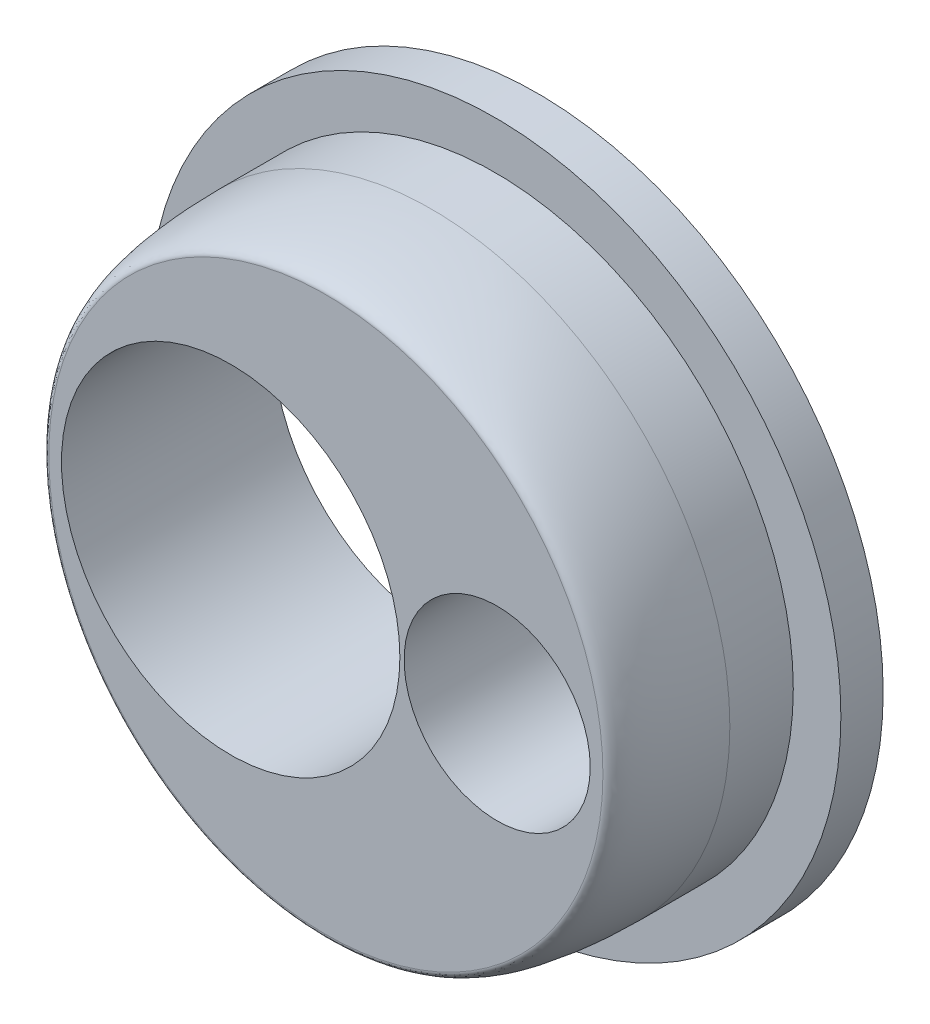
ISO-10303-21;
HEADER;
FILE_DESCRIPTION(('STEP AP214'),'2;1');
FILE_NAME('part.step','',(''),(''),'','','');
FILE_SCHEMA(('AUTOMOTIVE_DESIGN { 1 0 10303 214 1 1 1 1 }'));
ENDSEC;
DATA;
#1=APPLICATION_CONTEXT('core data for automotive mechanical design processes');
#2=APPLICATION_PROTOCOL_DEFINITION('international standard','automotive_design',2000,#1);
#3=PRODUCT_CONTEXT('',#1,'mechanical');
#4=PRODUCT('Part','Part','',(#3));
#5=PRODUCT_RELATED_PRODUCT_CATEGORY('part','',(#4));
#6=PRODUCT_DEFINITION_FORMATION('','',#4);
#7=PRODUCT_DEFINITION_CONTEXT('part definition',#1,'design');
#8=PRODUCT_DEFINITION('design','',#6,#7);
#9=PRODUCT_DEFINITION_SHAPE('','',#8);
#10=(LENGTH_UNIT() NAMED_UNIT(*) SI_UNIT(.MILLI.,.METRE.));
#11=(NAMED_UNIT(*) PLANE_ANGLE_UNIT() SI_UNIT($,.RADIAN.));
#12=(NAMED_UNIT(*) SI_UNIT($,.STERADIAN.) SOLID_ANGLE_UNIT());
#13=UNCERTAINTY_MEASURE_WITH_UNIT(LENGTH_MEASURE(1.E-05),#10,'distance_accuracy_value','');
#14=(GEOMETRIC_REPRESENTATION_CONTEXT(3) GLOBAL_UNCERTAINTY_ASSIGNED_CONTEXT((#13)) GLOBAL_UNIT_ASSIGNED_CONTEXT((#10,
#11,#12)) REPRESENTATION_CONTEXT('',''));
#15=CARTESIAN_POINT('',(0.,0.,0.));
#16=DIRECTION('',(0.,0.,1.));
#17=DIRECTION('',(1.,0.,0.));
#18=AXIS2_PLACEMENT_3D('',#15,#16,#17);
#19=CARTESIAN_POINT('',(0.,0.,2.));
#20=DIRECTION('',(0.,0.,1.));
#21=DIRECTION('',(1.,0.,0.));
#22=AXIS2_PLACEMENT_3D('',#19,#20,#21);
#23=PLANE('',#22);
#24=CARTESIAN_POINT('',(0.,0.,2.));
#25=DIRECTION('',(0.,0.,1.));
#26=DIRECTION('',(1.,0.,0.));
#27=AXIS2_PLACEMENT_3D('',#24,#25,#26);
#28=CIRCLE('',#27,14.1);
#29=CARTESIAN_POINT('',(14.1,0.,2.));
#30=VERTEX_POINT('',#29);
#31=EDGE_CURVE('E55',#30,#30,#28,.T.);
#32=ORIENTED_EDGE('',*,*,#31,.F.);
#33=EDGE_LOOP('',(#32));
#34=FACE_BOUND('',#33,.T.);
#35=CARTESIAN_POINT('',(0.,0.,2.));
#36=DIRECTION('',(0.,0.,1.));
#37=DIRECTION('',(1.,0.,0.));
#38=AXIS2_PLACEMENT_3D('',#35,#36,#37);
#39=CIRCLE('',#38,16.35);
#40=CARTESIAN_POINT('',(16.35,0.,2.));
#41=VERTEX_POINT('',#40);
#42=EDGE_CURVE('E60',#41,#41,#39,.T.);
#43=ORIENTED_EDGE('',*,*,#42,.T.);
#44=EDGE_LOOP('',(#43));
#45=FACE_BOUND('',#44,.T.);
#46=ADVANCED_FACE('F37',(#34,#45),#23,.T.);
#47=CARTESIAN_POINT('',(0.,0.,0.));
#48=DIRECTION('',(0.,0.,1.));
#49=DIRECTION('',(1.,0.,0.));
#50=AXIS2_PLACEMENT_3D('',#47,#48,#49);
#51=PLANE('',#50);
#52=CARTESIAN_POINT('',(0.,0.,0.));
#53=DIRECTION('',(0.,0.,1.));
#54=DIRECTION('',(1.,0.,0.));
#55=AXIS2_PLACEMENT_3D('',#52,#53,#54);
#56=CIRCLE('',#55,16.35);
#57=CARTESIAN_POINT('',(16.35,0.,0.));
#58=VERTEX_POINT('',#57);
#59=EDGE_CURVE('E65',#58,#58,#56,.T.);
#60=ORIENTED_EDGE('',*,*,#59,.F.);
#61=EDGE_LOOP('',(#60));
#62=FACE_BOUND('',#61,.T.);
#63=CARTESIAN_POINT('',(8.1,0.,0.));
#64=DIRECTION('',(0.,0.,1.));
#65=DIRECTION('',(1.,0.,0.));
#66=AXIS2_PLACEMENT_3D('',#63,#64,#65);
#67=CIRCLE('',#66,4.4);
#68=CARTESIAN_POINT('',(12.5,0.,0.));
#69=VERTEX_POINT('',#68);
#70=EDGE_CURVE('E74',#69,#69,#67,.T.);
#71=ORIENTED_EDGE('',*,*,#70,.T.);
#72=EDGE_LOOP('',(#71));
#73=FACE_BOUND('',#72,.T.);
#74=CARTESIAN_POINT('',(-4.5,0.,0.));
#75=DIRECTION('',(0.,0.,1.));
#76=DIRECTION('',(1.,0.,0.));
#77=AXIS2_PLACEMENT_3D('',#74,#75,#76);
#78=CIRCLE('',#77,8.);
#79=CARTESIAN_POINT('',(3.5,0.,0.));
#80=VERTEX_POINT('',#79);
#81=EDGE_CURVE('E71',#80,#80,#78,.T.);
#82=ORIENTED_EDGE('',*,*,#81,.T.);
#83=EDGE_LOOP('',(#82));
#84=FACE_BOUND('',#83,.T.);
#85=ADVANCED_FACE('F120',(#62,#73,#84),#51,.F.);
#86=CARTESIAN_POINT('',(0.,0.,2.));
#87=DIRECTION('',(0.,0.,-1.));
#88=DIRECTION('',(-1.,0.,0.));
#89=AXIS2_PLACEMENT_3D('',#86,#87,#88);
#90=CYLINDRICAL_SURFACE('',#89,16.35);
#91=ORIENTED_EDGE('',*,*,#42,.F.);
#92=EDGE_LOOP('',(#91));
#93=FACE_BOUND('',#92,.T.);
#94=ORIENTED_EDGE('',*,*,#59,.T.);
#95=EDGE_LOOP('',(#94));
#96=FACE_BOUND('',#95,.T.);
#97=ADVANCED_FACE('F126',(#93,#96),#90,.T.);
#98=CARTESIAN_POINT('',(8.1,0.,2.));
#99=DIRECTION('',(0.,0.,-1.));
#100=DIRECTION('',(-1.,0.,0.));
#101=AXIS2_PLACEMENT_3D('',#98,#99,#100);
#102=CYLINDRICAL_SURFACE('',#101,4.4);
#103=ORIENTED_EDGE('',*,*,#70,.F.);
#104=EDGE_LOOP('',(#103));
#105=FACE_BOUND('',#104,.T.);
#106=CARTESIAN_POINT('',(8.1,0.,10.));
#107=DIRECTION('',(0.,0.,1.));
#108=DIRECTION('',(1.,0.,0.));
#109=AXIS2_PLACEMENT_3D('',#106,#107,#108);
#110=CIRCLE('',#109,4.4);
#111=CARTESIAN_POINT('',(12.5,0.,10.));
#112=VERTEX_POINT('',#111);
#113=EDGE_CURVE('E69',#112,#112,#110,.T.);
#114=ORIENTED_EDGE('',*,*,#113,.T.);
#115=EDGE_LOOP('',(#114));
#116=FACE_BOUND('',#115,.T.);
#117=ADVANCED_FACE('F130',(#105,#116),#102,.F.);
#118=CARTESIAN_POINT('',(-4.5,0.,2.));
#119=DIRECTION('',(0.,0.,-1.));
#120=DIRECTION('',(-1.,0.,0.));
#121=AXIS2_PLACEMENT_3D('',#118,#119,#120);
#122=CYLINDRICAL_SURFACE('',#121,8.);
#123=ORIENTED_EDGE('',*,*,#81,.F.);
#124=EDGE_LOOP('',(#123));
#125=FACE_BOUND('',#124,.T.);
#126=CARTESIAN_POINT('',(-4.5,0.,10.));
#127=DIRECTION('',(0.,0.,1.));
#128=DIRECTION('',(1.,0.,0.));
#129=AXIS2_PLACEMENT_3D('',#126,#127,#128);
#130=CIRCLE('',#129,8.);
#131=CARTESIAN_POINT('',(3.5,0.,10.));
#132=VERTEX_POINT('',#131);
#133=EDGE_CURVE('E149',#132,#132,#130,.T.);
#134=ORIENTED_EDGE('',*,*,#133,.T.);
#135=EDGE_LOOP('',(#134));
#136=FACE_BOUND('',#135,.T.);
#137=ADVANCED_FACE('F93',(#125,#136),#122,.F.);
#138=CARTESIAN_POINT('',(0.,0.,10.));
#139=DIRECTION('',(0.,0.,1.));
#140=DIRECTION('',(1.,0.,0.));
#141=AXIS2_PLACEMENT_3D('',#138,#139,#140);
#142=PLANE('',#141);
#143=CARTESIAN_POINT('',(13.1,0.,10.));
#144=CARTESIAN_POINT('',(13.1,-1.71478598841934,10.));
#145=CARTESIAN_POINT('',(12.7590420637165,-3.42889728664574,10.));
#146=CARTESIAN_POINT('',(11.4466016880792,-6.59740864131965,10.));
#147=CARTESIAN_POINT('',(10.4756356342397,-8.05056203284785,10.));
#148=CARTESIAN_POINT('',(8.05056203284779,-10.4756356342398,10.));
#149=CARTESIAN_POINT('',(6.5974086413211,-11.4466016880777,10.));
#150=CARTESIAN_POINT('',(3.42889728664421,-12.7590420637181,10.));
#151=CARTESIAN_POINT('',(1.71478598841906,-13.1,10.));
#152=CARTESIAN_POINT('',(-1.71478598841902,-13.1,10.));
#153=CARTESIAN_POINT('',(-3.42889728664574,-12.759042063718,10.));
#154=CARTESIAN_POINT('',(-6.59740864131965,-11.4466016880777,10.));
#155=CARTESIAN_POINT('',(-8.0505620328493,-10.4756356342382,10.));
#156=CARTESIAN_POINT('',(-10.4756356342382,-8.05056203284931,10.));
#157=CARTESIAN_POINT('',(-11.4466016880777,-6.59740864132036,10.));
#158=CARTESIAN_POINT('',(-12.7590420637181,-3.42889728664496,10.));
#159=CARTESIAN_POINT('',(-13.1,-1.71478598841904,10.));
#160=CARTESIAN_POINT('',(-13.1,1.71478598841904,10.));
#161=CARTESIAN_POINT('',(-12.759042063718,3.42889728664499,10.));
#162=CARTESIAN_POINT('',(-11.4466016880777,6.59740864132039,10.));
#163=CARTESIAN_POINT('',(-10.4756356342382,8.05056203284781,10.));
#164=CARTESIAN_POINT('',(-8.05056203284931,10.4756356342397,10.));
#165=CARTESIAN_POINT('',(-6.59740864132024,11.4466016880781,10.));
#166=CARTESIAN_POINT('',(-3.42889728664513,12.7590420637176,10.));
#167=CARTESIAN_POINT('',(-1.71478598841904,13.1,10.));
#168=CARTESIAN_POINT('',(1.71478598841904,13.1,10.));
#169=CARTESIAN_POINT('',(3.42889728664512,12.7590420637176,10.));
#170=CARTESIAN_POINT('',(6.59740864132023,11.4466016880781,10.));
#171=CARTESIAN_POINT('',(8.05056203284986,10.4756356342377,10.));
#172=CARTESIAN_POINT('',(10.4756356342377,8.05056203284986,10.));
#173=CARTESIAN_POINT('',(11.4466016880796,6.59740864132023,10.));
#174=CARTESIAN_POINT('',(12.7590420637161,3.42889728664512,10.));
#175=CARTESIAN_POINT('',(13.1,1.71478598841933,10.));
#176=CARTESIAN_POINT('',(13.1,0.,10.));
#177=(BOUNDED_CURVE() B_SPLINE_CURVE(3,(#143,#144,#145,#146,#147,#148,#149,#150,#151,#152,#153,
#154,#155,#156,#157,#158,#159,#160,#161,#162,#163,#164,#165,#166,#167,#168,#169,#170,#171,#172,
#173,#174,#175,#176),.UNSPECIFIED.,.T.,.F.) B_SPLINE_CURVE_WITH_KNOTS((4,2,2,2,2,2,2,2,2,2,2,2,
2,2,2,2,4),(0.,0.392699081698725,0.785398163397448,1.17809724509617,1.5707963267949,
1.96349540849362,2.35619449019234,2.74889357189107,3.14159265358979,3.53429173528852,
3.92699081698724,4.31968989868597,4.71238898038469,5.10508806208341,5.49778714378214,
5.89048622548086,6.28318530717959),
.UNSPECIFIED.) CURVE() GEOMETRIC_REPRESENTATION_ITEM() RATIONAL_B_SPLINE_CURVE((1.,1.,1.,1.,1.,
1.,1.,1.,1.,1.,1.,1.,1.,1.,1.,1.,1.,1.,1.,1.,1.,1.,1.,1.,1.,1.,1.,1.,1.,1.,1.,1.,1.,1.)) REPRESENTATION_ITEM(''));
#178=CARTESIAN_POINT('',(13.1,0.,10.));
#179=VERTEX_POINT('',#178);
#180=EDGE_CURVE('E50',#179,#179,#177,.F.);
#181=ORIENTED_EDGE('',*,*,#180,.T.);
#182=EDGE_LOOP('',(#181));
#183=FACE_BOUND('',#182,.T.);
#184=ORIENTED_EDGE('',*,*,#113,.F.);
#185=EDGE_LOOP('',(#184));
#186=FACE_BOUND('',#185,.T.);
#187=ORIENTED_EDGE('',*,*,#133,.F.);
#188=EDGE_LOOP('',(#187));
#189=FACE_BOUND('',#188,.T.);
#190=ADVANCED_FACE('F83',(#183,#186,#189),#142,.T.);
#191=CARTESIAN_POINT('',(0.,0.,10.));
#192=DIRECTION('',(0.,0.,-1.));
#193=DIRECTION('',(-1.,0.,0.));
#194=AXIS2_PLACEMENT_3D('',#191,#192,#193);
#195=CYLINDRICAL_SURFACE('',#194,14.1);
#196=CARTESIAN_POINT('',(14.1,0.,5.));
#197=CARTESIAN_POINT('',(14.1,1.8456856821918,5.));
#198=CARTESIAN_POINT('',(13.733014740337,3.69064517112253,5.));
#199=CARTESIAN_POINT('',(12.3203880764813,7.101027621573,5.));
#200=CARTESIAN_POINT('',(11.2753024765458,8.66510875291481,5.));
#201=CARTESIAN_POINT('',(8.66510875291481,11.2753024765458,5.));
#202=CARTESIAN_POINT('',(7.10102762157342,12.3203880764811,5.));
#203=CARTESIAN_POINT('',(3.69064517112211,13.7330147403372,5.));
#204=CARTESIAN_POINT('',(1.84568568219149,14.1,5.));
#205=CARTESIAN_POINT('',(-1.84568568219148,14.1,5.));
#206=CARTESIAN_POINT('',(-3.69064517112264,13.733014740337,5.));
#207=CARTESIAN_POINT('',(-7.1010276215729,12.3203880764813,5.));
#208=CARTESIAN_POINT('',(-8.66510875291326,11.2753024765474,5.));
#209=CARTESIAN_POINT('',(-11.2753024765474,8.66510875291324,5.));
#210=CARTESIAN_POINT('',(-12.3203880764808,7.10102762157406,5.));
#211=CARTESIAN_POINT('',(-13.7330147403375,3.69064517112151,5.));
#212=CARTESIAN_POINT('',(-14.1,1.84568568219149,5.));
#213=CARTESIAN_POINT('',(-14.1,-1.84568568219148,5.));
#214=CARTESIAN_POINT('',(-13.7330147403375,-3.69064517112147,5.));
#215=CARTESIAN_POINT('',(-12.3203880764808,-7.10102762157403,5.));
#216=CARTESIAN_POINT('',(-11.2753024765466,-8.665108752914,5.));
#217=CARTESIAN_POINT('',(-8.66510875291398,-11.2753024765467,5.));
#218=CARTESIAN_POINT('',(-7.10102762157343,-12.3203880764811,5.));
#219=CARTESIAN_POINT('',(-3.69064517112214,-13.7330147403372,5.));
#220=CARTESIAN_POINT('',(-1.84568568219146,-14.1,5.));
#221=CARTESIAN_POINT('',(1.84568568219151,-14.1,5.));
#222=CARTESIAN_POINT('',(3.69064517112083,-13.7330147403377,5.));
#223=CARTESIAN_POINT('',(7.10102762157466,-12.3203880764806,5.));
#224=CARTESIAN_POINT('',(8.66510875291247,-11.2753024765482,5.));
#225=CARTESIAN_POINT('',(11.2753024765481,-8.66510875291254,5.));
#226=CARTESIAN_POINT('',(12.3203880764813,-7.1010276215729,5.));
#227=CARTESIAN_POINT('',(13.733014740337,-3.69064517112267,5.));
#228=CARTESIAN_POINT('',(14.1,-1.8456856821918,5.));
#229=CARTESIAN_POINT('',(14.1,0.,5.));
#230=(BOUNDED_CURVE() B_SPLINE_CURVE(3,(#196,#197,#198,#199,#200,#201,#202,#203,#204,#205,#206,
#207,#208,#209,#210,#211,#212,#213,#214,#215,#216,#217,#218,#219,#220,#221,#222,#223,#224,#225,
#226,#227,#228,#229),.UNSPECIFIED.,.T.,.F.) B_SPLINE_CURVE_WITH_KNOTS((4,2,2,2,2,2,2,2,2,2,2,2,
2,2,2,2,4),(0.,0.392699081698724,0.785398163397448,1.17809724509617,1.5707963267949,
1.96349540849362,2.35619449019234,2.74889357189107,3.14159265358979,3.53429173528852,
3.92699081698724,4.31968989868597,4.71238898038469,5.10508806208341,5.49778714378214,
5.89048622548086,6.28318530717959),
.UNSPECIFIED.) CURVE() GEOMETRIC_REPRESENTATION_ITEM() RATIONAL_B_SPLINE_CURVE((1.,1.,1.,1.,1.,
1.,1.,1.,1.,1.,1.,1.,1.,1.,1.,1.,1.,1.,1.,1.,1.,1.,1.,1.,1.,1.,1.,1.,1.,1.,1.,1.,1.,1.)) REPRESENTATION_ITEM(''));
#231=CARTESIAN_POINT('',(14.1,0.,5.));
#232=VERTEX_POINT('',#231);
#233=EDGE_CURVE('E11',#232,#232,#230,.F.);
#234=ORIENTED_EDGE('',*,*,#233,.T.);
#235=EDGE_LOOP('',(#234));
#236=FACE_BOUND('',#235,.T.);
#237=ORIENTED_EDGE('',*,*,#31,.T.);
#238=EDGE_LOOP('',(#237));
#239=FACE_BOUND('',#238,.T.);
#240=ADVANCED_FACE('F92',(#236,#239),#195,.T.);
#241=CARTESIAN_POINT('',(13.1,0.,10.));
#242=CARTESIAN_POINT('',(13.1,1.71478598841933,10.));
#243=CARTESIAN_POINT('',(12.7590420637161,3.42889728664512,10.));
#244=CARTESIAN_POINT('',(11.4466016880796,6.59740864132023,10.));
#245=CARTESIAN_POINT('',(10.4756356342377,8.05056203284986,10.));
#246=CARTESIAN_POINT('',(8.05056203284986,10.4756356342377,10.));
#247=CARTESIAN_POINT('',(6.59740864132023,11.4466016880781,10.));
#248=CARTESIAN_POINT('',(3.42889728664512,12.7590420637176,10.));
#249=CARTESIAN_POINT('',(1.71478598841904,13.1,10.));
#250=CARTESIAN_POINT('',(-1.71478598841904,13.1,10.));
#251=CARTESIAN_POINT('',(-3.42889728664513,12.7590420637176,10.));
#252=CARTESIAN_POINT('',(-6.59740864132024,11.4466016880781,10.));
#253=CARTESIAN_POINT('',(-8.05056203284931,10.4756356342397,10.));
#254=CARTESIAN_POINT('',(-10.4756356342382,8.05056203284781,10.));
#255=CARTESIAN_POINT('',(-11.4466016880777,6.59740864132039,10.));
#256=CARTESIAN_POINT('',(-12.759042063718,3.42889728664499,10.));
#257=CARTESIAN_POINT('',(-13.1,1.71478598841904,10.));
#258=CARTESIAN_POINT('',(-13.1,-1.71478598841904,10.));
#259=CARTESIAN_POINT('',(-12.7590420637181,-3.42889728664496,10.));
#260=CARTESIAN_POINT('',(-11.4466016880777,-6.59740864132036,10.));
#261=CARTESIAN_POINT('',(-10.4756356342382,-8.05056203284931,10.));
#262=CARTESIAN_POINT('',(-8.0505620328493,-10.4756356342382,10.));
#263=CARTESIAN_POINT('',(-6.59740864131965,-11.4466016880777,10.));
#264=CARTESIAN_POINT('',(-3.42889728664574,-12.759042063718,10.));
#265=CARTESIAN_POINT('',(-1.71478598841902,-13.1,10.));
#266=CARTESIAN_POINT('',(1.71478598841906,-13.1,10.));
#267=CARTESIAN_POINT('',(3.42889728664421,-12.7590420637181,10.));
#268=CARTESIAN_POINT('',(6.5974086413211,-11.4466016880777,10.));
#269=CARTESIAN_POINT('',(8.05056203284779,-10.4756356342398,10.));
#270=CARTESIAN_POINT('',(10.4756356342397,-8.05056203284785,10.));
#271=CARTESIAN_POINT('',(11.4466016880792,-6.59740864131965,10.));
#272=CARTESIAN_POINT('',(12.7590420637165,-3.42889728664574,10.));
#273=CARTESIAN_POINT('',(13.1,-1.71478598841934,10.));
#274=CARTESIAN_POINT('',(13.1,0.,10.));
#275=CARTESIAN_POINT('',(14.1,0.,10.));
#276=CARTESIAN_POINT('',(14.1,1.8456856821918,10.));
#277=CARTESIAN_POINT('',(13.7330147403346,3.69064517112227,9.99999999999851));
#278=CARTESIAN_POINT('',(12.3203880764837,7.10102762157327,10.0000000000015));
#279=CARTESIAN_POINT('',(11.2753024765458,8.66510875291481,10.));
#280=CARTESIAN_POINT('',(8.66510875291481,11.2753024765458,10.));
#281=CARTESIAN_POINT('',(7.101027621574,12.3203880764807,10.000000000003));
#282=CARTESIAN_POINT('',(3.69064517112152,13.7330147403376,9.99999999999702));
#283=CARTESIAN_POINT('',(1.84568568219149,14.1,10.));
#284=CARTESIAN_POINT('',(-1.84568568219148,14.1,10.));
#285=CARTESIAN_POINT('',(-3.69064517112302,13.7330147403361,9.99999999999851));
#286=CARTESIAN_POINT('',(-7.10102762157253,12.3203880764822,10.0000000000015));
#287=CARTESIAN_POINT('',(-8.665108752914,11.2753024765481,10.));
#288=CARTESIAN_POINT('',(-11.2753024765467,8.6651087529125,10.));
#289=CARTESIAN_POINT('',(-12.3203880764801,7.10102762157452,10.));
#290=CARTESIAN_POINT('',(-13.7330147403381,3.69064517112104,10.));
#291=CARTESIAN_POINT('',(-14.1,1.84568568219149,10.));
#292=CARTESIAN_POINT('',(-14.1,-1.84568568219148,10.));
#293=CARTESIAN_POINT('',(-13.7330147403382,-3.69064517112249,10.));
#294=CARTESIAN_POINT('',(-12.3203880764801,-7.101027621573,10.));
#295=CARTESIAN_POINT('',(-11.2753024765466,-8.665108752914,10.));
#296=CARTESIAN_POINT('',(-8.66510875291398,-11.2753024765467,10.));
#297=CARTESIAN_POINT('',(-7.10102762157378,-12.3203880764801,10.0000000000015));
#298=CARTESIAN_POINT('',(-3.69064517112179,-13.7330147403381,9.99999999999851));
#299=CARTESIAN_POINT('',(-1.84568568219146,-14.1,10.));
#300=CARTESIAN_POINT('',(1.84568568219151,-14.1,10.));
#301=CARTESIAN_POINT('',(3.69064517112175,-13.7330147403382,9.99999999999851));
#302=CARTESIAN_POINT('',(7.10102762157374,-12.3203880764801,10.0000000000015));
#303=CARTESIAN_POINT('',(8.66510875291248,-11.2753024765482,10.));
#304=CARTESIAN_POINT('',(11.2753024765481,-8.66510875291253,10.));
#305=CARTESIAN_POINT('',(12.3203880764816,-7.10102762157304,10.));
#306=CARTESIAN_POINT('',(13.7330147403367,-3.69064517112253,10.));
#307=CARTESIAN_POINT('',(14.1,-1.8456856821918,10.));
#308=CARTESIAN_POINT('',(14.1,0.,10.));
#309=CARTESIAN_POINT('',(14.1,0.,5.));
#310=CARTESIAN_POINT('',(14.1,1.8456856821918,5.));
#311=CARTESIAN_POINT('',(13.733014740337,3.69064517112253,5.));
#312=CARTESIAN_POINT('',(12.3203880764813,7.101027621573,5.));
#313=CARTESIAN_POINT('',(11.2753024765458,8.66510875291481,5.));
#314=CARTESIAN_POINT('',(8.66510875291481,11.2753024765458,5.));
#315=CARTESIAN_POINT('',(7.10102762157342,12.3203880764811,5.));
#316=CARTESIAN_POINT('',(3.69064517112211,13.7330147403372,5.));
#317=CARTESIAN_POINT('',(1.84568568219149,14.1,5.));
#318=CARTESIAN_POINT('',(-1.84568568219148,14.1,5.));
#319=CARTESIAN_POINT('',(-3.69064517112264,13.733014740337,5.));
#320=CARTESIAN_POINT('',(-7.1010276215729,12.3203880764813,5.));
#321=CARTESIAN_POINT('',(-8.66510875291326,11.2753024765474,5.));
#322=CARTESIAN_POINT('',(-11.2753024765474,8.66510875291324,5.));
#323=CARTESIAN_POINT('',(-12.3203880764808,7.10102762157406,5.));
#324=CARTESIAN_POINT('',(-13.7330147403375,3.69064517112151,5.));
#325=CARTESIAN_POINT('',(-14.1,1.84568568219149,5.));
#326=CARTESIAN_POINT('',(-14.1,-1.84568568219148,5.));
#327=CARTESIAN_POINT('',(-13.7330147403375,-3.69064517112147,5.));
#328=CARTESIAN_POINT('',(-12.3203880764808,-7.10102762157403,5.));
#329=CARTESIAN_POINT('',(-11.2753024765466,-8.665108752914,5.));
#330=CARTESIAN_POINT('',(-8.66510875291398,-11.2753024765467,5.));
#331=CARTESIAN_POINT('',(-7.10102762157343,-12.3203880764811,5.));
#332=CARTESIAN_POINT('',(-3.69064517112214,-13.7330147403372,5.));
#333=CARTESIAN_POINT('',(-1.84568568219146,-14.1,5.));
#334=CARTESIAN_POINT('',(1.84568568219151,-14.1,5.));
#335=CARTESIAN_POINT('',(3.69064517112083,-13.7330147403377,5.));
#336=CARTESIAN_POINT('',(7.10102762157466,-12.3203880764806,5.));
#337=CARTESIAN_POINT('',(8.66510875291247,-11.2753024765482,5.));
#338=CARTESIAN_POINT('',(11.2753024765481,-8.66510875291254,5.));
#339=CARTESIAN_POINT('',(12.3203880764813,-7.1010276215729,5.));
#340=CARTESIAN_POINT('',(13.733014740337,-3.69064517112267,5.));
#341=CARTESIAN_POINT('',(14.1,-1.8456856821918,5.));
#342=CARTESIAN_POINT('',(14.1,0.,5.));
#343=(BOUNDED_SURFACE() B_SPLINE_SURFACE(2,3,((#241,#242,#243,#244,#245,#246,#247,#248,#249,
#250,#251,#252,#253,#254,#255,#256,#257,#258,#259,#260,#261,#262,#263,#264,#265,#266,#267,#268,
#269,#270,#271,#272,#273,#274),(#275,#276,#277,#278,#279,#280,#281,#282,#283,#284,#285,#286,
#287,#288,#289,#290,#291,#292,#293,#294,#295,#296,#297,#298,#299,#300,#301,#302,#303,#304,#305,
#306,#307,#308),(#309,#310,#311,#312,#313,#314,#315,#316,#317,#318,#319,#320,#321,#322,#323,
#324,#325,#326,#327,#328,#329,#330,#331,#332,#333,#334,#335,#336,#337,#338,#339,#340,#341,
#342)),.UNSPECIFIED.,.F.,.T.,.F.) B_SPLINE_SURFACE_WITH_KNOTS((3,3),(4,2,2,2,2,2,2,2,2,2,2,2,2,
2,2,2,4),(0.,1.),(0.,0.392699081698724,0.785398163397448,1.17809724509617,1.5707963267949,
1.96349540849362,2.35619449019234,2.74889357189107,3.14159265358979,3.53429173528852,
3.92699081698724,4.31968989868597,4.71238898038469,5.10508806208341,5.49778714378214,
5.89048622548086,6.28318530717959),
.UNSPECIFIED.) GEOMETRIC_REPRESENTATION_ITEM() RATIONAL_B_SPLINE_SURFACE(((1.,1.,1.,1.,1.,1.,1.,
1.,1.,1.,1.,1.,1.,1.,1.,1.,1.,1.,1.,1.,1.,1.,1.,1.,1.,1.,1.,1.,1.,1.,1.,1.,1.,1.),
(0.707106781186548,0.707106781186548,0.707106781186547,0.707106781186547,0.707106781186548,
0.707106781186548,0.707106781186548,0.707106781186548,0.707106781186548,0.707106781186548,
0.707106781186548,0.707106781186548,0.707106781186548,0.707106781186548,0.707106781186548,
0.707106781186548,0.707106781186548,0.707106781186548,0.707106781186548,0.707106781186548,
0.707106781186548,0.707106781186548,0.707106781186548,0.707106781186548,0.707106781186548,
0.707106781186548,0.707106781186548,0.707106781186548,0.707106781186548,0.707106781186548,
0.707106781186548,0.707106781186548,0.707106781186548,0.707106781186548),(1.,1.,1.,1.,1.,1.,1.,
1.,1.,1.,1.,1.,1.,1.,1.,1.,1.,1.,1.,1.,1.,1.,1.,1.,1.,1.,1.,1.,1.,1.,1.,1.,1.,1.))) REPRESENTATION_ITEM('') SURFACE());
#344=ORIENTED_EDGE('',*,*,#233,.F.);
#345=EDGE_LOOP('',(#344));
#346=FACE_BOUND('',#345,.T.);
#347=ORIENTED_EDGE('',*,*,#180,.F.);
#348=EDGE_LOOP('',(#347));
#349=FACE_BOUND('',#348,.T.);
#350=ADVANCED_FACE('F40',(#346,#349),#343,.T.);
#351=CLOSED_SHELL('',(#46,#85,#97,#117,#137,#190,#240,#350));
#352=MANIFOLD_SOLID_BREP('B2',#351);
#353=ADVANCED_BREP_SHAPE_REPRESENTATION('',(#18,#352),#14);
#354=SHAPE_DEFINITION_REPRESENTATION(#9,#353);
ENDSEC;
END-ISO-10303-21;
